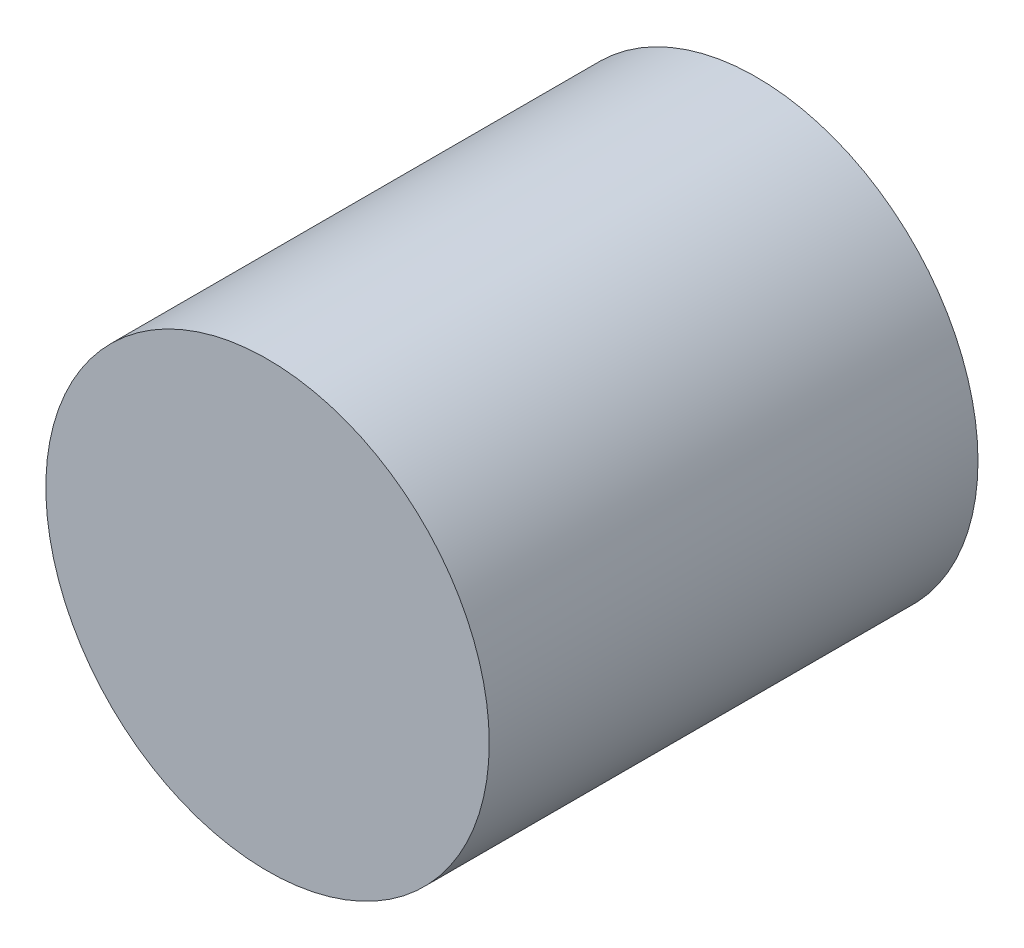
ISO-10303-21;
HEADER;
FILE_DESCRIPTION(('STEP AP214'),'2;1');
FILE_NAME('part.step','',(''),(''),'','','');
FILE_SCHEMA(('AUTOMOTIVE_DESIGN { 1 0 10303 214 1 1 1 1 }'));
ENDSEC;
DATA;
#1=APPLICATION_CONTEXT('core data for automotive mechanical design processes');
#2=APPLICATION_PROTOCOL_DEFINITION('international standard','automotive_design',2000,#1);
#3=PRODUCT_CONTEXT('',#1,'mechanical');
#4=PRODUCT('Part','Part','',(#3));
#5=PRODUCT_RELATED_PRODUCT_CATEGORY('part','',(#4));
#6=PRODUCT_DEFINITION_FORMATION('','',#4);
#7=PRODUCT_DEFINITION_CONTEXT('part definition',#1,'design');
#8=PRODUCT_DEFINITION('design','',#6,#7);
#9=PRODUCT_DEFINITION_SHAPE('','',#8);
#10=(LENGTH_UNIT() NAMED_UNIT(*) SI_UNIT(.MILLI.,.METRE.));
#11=(NAMED_UNIT(*) PLANE_ANGLE_UNIT() SI_UNIT($,.RADIAN.));
#12=(NAMED_UNIT(*) SI_UNIT($,.STERADIAN.) SOLID_ANGLE_UNIT());
#13=UNCERTAINTY_MEASURE_WITH_UNIT(LENGTH_MEASURE(1.E-05),#10,'distance_accuracy_value','');
#14=(GEOMETRIC_REPRESENTATION_CONTEXT(3) GLOBAL_UNCERTAINTY_ASSIGNED_CONTEXT((#13)) GLOBAL_UNIT_ASSIGNED_CONTEXT((#10,
#11,#12)) REPRESENTATION_CONTEXT('',''));
#15=CARTESIAN_POINT('',(0.,0.,0.));
#16=DIRECTION('',(0.,0.,1.));
#17=DIRECTION('',(1.,0.,0.));
#18=AXIS2_PLACEMENT_3D('',#15,#16,#17);
#19=CARTESIAN_POINT('',(7.125,-5.675,21.122625));
#20=DIRECTION('',(0.,0.,-1.));
#21=DIRECTION('',(-1.,0.,0.));
#22=AXIS2_PLACEMENT_3D('',#19,#20,#21);
#23=CYLINDRICAL_SURFACE('',#22,9.581625);
#24=CARTESIAN_POINT('',(7.125,-5.675,21.122625));
#25=DIRECTION('',(0.,0.,1.));
#26=DIRECTION('',(1.,0.,0.));
#27=AXIS2_PLACEMENT_3D('',#24,#25,#26);
#28=CIRCLE('',#27,9.581625);
#29=CARTESIAN_POINT('',(16.706625,-5.675,21.122625));
#30=VERTEX_POINT('',#29);
#31=EDGE_CURVE('E10',#30,#30,#28,.T.);
#32=ORIENTED_EDGE('',*,*,#31,.F.);
#33=EDGE_LOOP('',(#32));
#34=FACE_BOUND('',#33,.T.);
#35=CARTESIAN_POINT('',(7.125,-5.675,0.));
#36=DIRECTION('',(0.,0.,1.));
#37=DIRECTION('',(1.,0.,0.));
#38=AXIS2_PLACEMENT_3D('',#35,#36,#37);
#39=CIRCLE('',#38,9.581625);
#40=CARTESIAN_POINT('',(16.706625,-5.675,0.));
#41=VERTEX_POINT('',#40);
#42=EDGE_CURVE('E45',#41,#41,#39,.T.);
#43=ORIENTED_EDGE('',*,*,#42,.T.);
#44=EDGE_LOOP('',(#43));
#45=FACE_BOUND('',#44,.T.);
#46=ADVANCED_FACE('F39',(#34,#45),#23,.T.);
#47=CARTESIAN_POINT('',(7.125,-5.675,21.122625));
#48=DIRECTION('',(0.,0.,1.));
#49=DIRECTION('',(1.,0.,0.));
#50=AXIS2_PLACEMENT_3D('',#47,#48,#49);
#51=PLANE('',#50);
#52=ORIENTED_EDGE('',*,*,#31,.T.);
#53=EDGE_LOOP('',(#52));
#54=FACE_BOUND('',#53,.T.);
#55=ADVANCED_FACE('F53',(#54),#51,.T.);
#56=CARTESIAN_POINT('',(7.125,-5.675,0.));
#57=DIRECTION('',(0.,0.,1.));
#58=DIRECTION('',(1.,0.,0.));
#59=AXIS2_PLACEMENT_3D('',#56,#57,#58);
#60=PLANE('',#59);
#61=ORIENTED_EDGE('',*,*,#42,.F.);
#62=EDGE_LOOP('',(#61));
#63=FACE_BOUND('',#62,.T.);
#64=ADVANCED_FACE('F55',(#63),#60,.F.);
#65=CLOSED_SHELL('',(#46,#55,#64));
#66=MANIFOLD_SOLID_BREP('B2',#65);
#67=ADVANCED_BREP_SHAPE_REPRESENTATION('',(#18,#66),#14);
#68=SHAPE_DEFINITION_REPRESENTATION(#9,#67);
ENDSEC;
END-ISO-10303-21;
